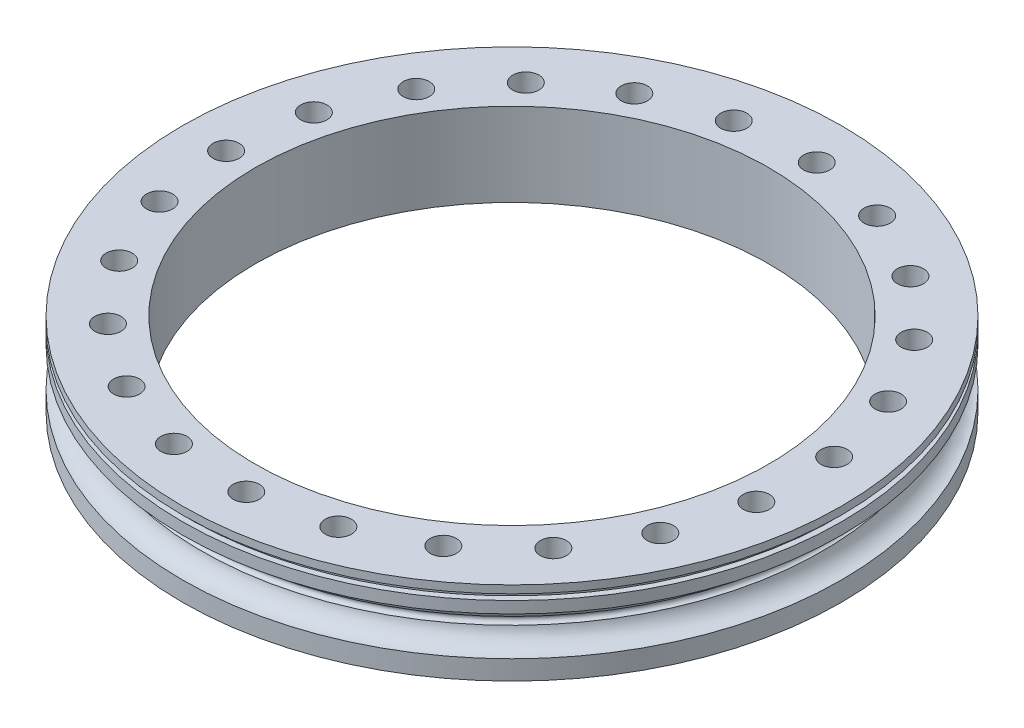
ISO-10303-21;
HEADER;
FILE_DESCRIPTION(('STEP AP214'),'2;1');
FILE_NAME('part.step','',(''),(''),'','','');
FILE_SCHEMA(('AUTOMOTIVE_DESIGN { 1 0 10303 214 1 1 1 1 }'));
ENDSEC;
DATA;
#1=APPLICATION_CONTEXT('core data for automotive mechanical design processes');
#2=APPLICATION_PROTOCOL_DEFINITION('international standard','automotive_design',2000,#1);
#3=PRODUCT_CONTEXT('',#1,'mechanical');
#4=PRODUCT('Part','Part','',(#3));
#5=PRODUCT_RELATED_PRODUCT_CATEGORY('part','',(#4));
#6=PRODUCT_DEFINITION_FORMATION('','',#4);
#7=PRODUCT_DEFINITION_CONTEXT('part definition',#1,'design');
#8=PRODUCT_DEFINITION('design','',#6,#7);
#9=PRODUCT_DEFINITION_SHAPE('','',#8);
#10=(LENGTH_UNIT() NAMED_UNIT(*) SI_UNIT(.MILLI.,.METRE.));
#11=(NAMED_UNIT(*) PLANE_ANGLE_UNIT() SI_UNIT($,.RADIAN.));
#12=(NAMED_UNIT(*) SI_UNIT($,.STERADIAN.) SOLID_ANGLE_UNIT());
#13=UNCERTAINTY_MEASURE_WITH_UNIT(LENGTH_MEASURE(1.E-05),#10,'distance_accuracy_value','');
#14=(GEOMETRIC_REPRESENTATION_CONTEXT(3) GLOBAL_UNCERTAINTY_ASSIGNED_CONTEXT((#13)) GLOBAL_UNIT_ASSIGNED_CONTEXT((#10,
#11,#12)) REPRESENTATION_CONTEXT('',''));
#15=CARTESIAN_POINT('',(0.,0.,0.));
#16=DIRECTION('',(0.,0.,1.));
#17=DIRECTION('',(1.,0.,0.));
#18=AXIS2_PLACEMENT_3D('',#15,#16,#17);
#19=CARTESIAN_POINT('',(0.,43.,0.));
#20=DIRECTION('',(0.,1.,0.));
#21=DIRECTION('',(-1.,0.,0.));
#22=AXIS2_PLACEMENT_3D('',#19,#20,#21);
#23=CYLINDRICAL_SURFACE('',#22,170.);
#24=CARTESIAN_POINT('',(0.,30.,0.));
#25=DIRECTION('',(0.,1.,0.));
#26=DIRECTION('',(-1.,0.,0.));
#27=AXIS2_PLACEMENT_3D('',#24,#25,#26);
#28=CIRCLE('',#27,170.);
#29=CARTESIAN_POINT('',(-170.,30.,0.));
#30=VERTEX_POINT('',#29);
#31=EDGE_CURVE('E71',#30,#30,#28,.T.);
#32=ORIENTED_EDGE('',*,*,#31,.T.);
#33=EDGE_LOOP('',(#32));
#34=FACE_BOUND('',#33,.T.);
#35=CARTESIAN_POINT('',(0.,36.,0.));
#36=DIRECTION('',(0.,1.,0.));
#37=DIRECTION('',(-1.,0.,0.));
#38=AXIS2_PLACEMENT_3D('',#35,#36,#37);
#39=CIRCLE('',#38,170.);
#40=CARTESIAN_POINT('',(-170.,36.,0.));
#41=VERTEX_POINT('',#40);
#42=EDGE_CURVE('E10',#41,#41,#39,.T.);
#43=ORIENTED_EDGE('',*,*,#42,.F.);
#44=EDGE_LOOP('',(#43));
#45=FACE_BOUND('',#44,.T.);
#46=ADVANCED_FACE('F31',(#34,#45),#23,.T.);
#47=CARTESIAN_POINT('',(-167.,36.,0.));
#48=DIRECTION('',(0.,1.,0.));
#49=DIRECTION('',(-1.,0.,0.));
#50=AXIS2_PLACEMENT_3D('',#47,#48,#49);
#51=PLANE('',#50);
#52=ORIENTED_EDGE('',*,*,#42,.T.);
#53=EDGE_LOOP('',(#52));
#54=FACE_BOUND('',#53,.T.);
#55=CARTESIAN_POINT('',(0.,36.,0.));
#56=DIRECTION('',(0.,1.,0.));
#57=DIRECTION('',(-1.,0.,0.));
#58=AXIS2_PLACEMENT_3D('',#55,#56,#57);
#59=CIRCLE('',#58,167.);
#60=CARTESIAN_POINT('',(-167.,36.,0.));
#61=VERTEX_POINT('',#60);
#62=EDGE_CURVE('E37',#61,#61,#59,.T.);
#63=ORIENTED_EDGE('',*,*,#62,.F.);
#64=EDGE_LOOP('',(#63));
#65=FACE_BOUND('',#64,.T.);
#66=ADVANCED_FACE('F314',(#54,#65),#51,.T.);
#67=CARTESIAN_POINT('',(0.,43.,0.));
#68=DIRECTION('',(0.,1.,0.));
#69=DIRECTION('',(-1.,0.,0.));
#70=AXIS2_PLACEMENT_3D('',#67,#68,#69);
#71=CYLINDRICAL_SURFACE('',#70,167.);
#72=ORIENTED_EDGE('',*,*,#62,.T.);
#73=EDGE_LOOP('',(#72));
#74=FACE_BOUND('',#73,.T.);
#75=CARTESIAN_POINT('',(0.,39.,0.));
#76=DIRECTION('',(0.,1.,0.));
#77=DIRECTION('',(-1.,0.,0.));
#78=AXIS2_PLACEMENT_3D('',#75,#76,#77);
#79=CIRCLE('',#78,167.);
#80=CARTESIAN_POINT('',(-167.,39.,0.));
#81=VERTEX_POINT('',#80);
#82=EDGE_CURVE('E41',#81,#81,#79,.T.);
#83=ORIENTED_EDGE('',*,*,#82,.F.);
#84=EDGE_LOOP('',(#83));
#85=FACE_BOUND('',#84,.T.);
#86=ADVANCED_FACE('F318',(#74,#85),#71,.T.);
#87=CARTESIAN_POINT('',(-170.,39.,0.));
#88=DIRECTION('',(0.,-1.,0.));
#89=DIRECTION('',(1.,0.,0.));
#90=AXIS2_PLACEMENT_3D('',#87,#88,#89);
#91=PLANE('',#90);
#92=ORIENTED_EDGE('',*,*,#82,.T.);
#93=EDGE_LOOP('',(#92));
#94=FACE_BOUND('',#93,.T.);
#95=CARTESIAN_POINT('',(0.,39.,0.));
#96=DIRECTION('',(0.,1.,0.));
#97=DIRECTION('',(-1.,0.,0.));
#98=AXIS2_PLACEMENT_3D('',#95,#96,#97);
#99=CIRCLE('',#98,170.);
#100=CARTESIAN_POINT('',(-170.,39.,0.));
#101=VERTEX_POINT('',#100);
#102=EDGE_CURVE('E45',#101,#101,#99,.T.);
#103=ORIENTED_EDGE('',*,*,#102,.F.);
#104=EDGE_LOOP('',(#103));
#105=FACE_BOUND('',#104,.T.);
#106=ADVANCED_FACE('F322',(#94,#105),#91,.T.);
#107=CARTESIAN_POINT('',(0.,43.,0.));
#108=DIRECTION('',(0.,1.,0.));
#109=DIRECTION('',(-1.,0.,0.));
#110=AXIS2_PLACEMENT_3D('',#107,#108,#109);
#111=CYLINDRICAL_SURFACE('',#110,170.);
#112=ORIENTED_EDGE('',*,*,#102,.T.);
#113=EDGE_LOOP('',(#112));
#114=FACE_BOUND('',#113,.T.);
#115=CARTESIAN_POINT('',(0.,43.,0.));
#116=DIRECTION('',(0.,1.,0.));
#117=DIRECTION('',(-1.,0.,0.));
#118=AXIS2_PLACEMENT_3D('',#115,#116,#117);
#119=CIRCLE('',#118,170.);
#120=CARTESIAN_POINT('',(-170.,43.,0.));
#121=VERTEX_POINT('',#120);
#122=EDGE_CURVE('E50',#121,#121,#119,.T.);
#123=ORIENTED_EDGE('',*,*,#122,.F.);
#124=EDGE_LOOP('',(#123));
#125=FACE_BOUND('',#124,.T.);
#126=ADVANCED_FACE('F227',(#114,#125),#111,.T.);
#127=CARTESIAN_POINT('',(-170.,43.,0.));
#128=DIRECTION('',(0.,1.,0.));
#129=DIRECTION('',(-1.,0.,0.));
#130=AXIS2_PLACEMENT_3D('',#127,#128,#129);
#131=PLANE('',#130);
#132=CARTESIAN_POINT('',(-142.030299883801,43.,39.7950237456592));
#133=DIRECTION('',(0.,1.,0.));
#134=DIRECTION('',(0.269796771157012,0.,0.962917287347803));
#135=AXIS2_PLACEMENT_3D('',#132,#133,#134);
#136=CIRCLE('',#135,6.75);
#137=CARTESIAN_POINT('',(-140.209171678491,43.,46.2947154352569));
#138=VERTEX_POINT('',#137);
#139=EDGE_CURVE('E206',#138,#138,#136,.T.);
#140=ORIENTED_EDGE('',*,*,#139,.F.);
#141=EDGE_LOOP('',(#140));
#142=FACE_BOUND('',#141,.T.);
#143=CARTESIAN_POINT('',(-126.026862170608,43.,76.6386326302249));
#144=DIRECTION('',(0.,1.,0.));
#145=DIRECTION('',(0.519583950035423,0.,0.854419404546495));
#146=AXIS2_PLACEMENT_3D('',#143,#144,#145);
#147=CIRCLE('',#146,6.75);
#148=CARTESIAN_POINT('',(-122.519670507869,43.,82.4059636109137));
#149=VERTEX_POINT('',#148);
#150=EDGE_CURVE('E200',#149,#149,#147,.T.);
#151=ORIENTED_EDGE('',*,*,#150,.F.);
#152=EDGE_LOOP('',(#151));
#153=FACE_BOUND('',#152,.T.);
#154=CARTESIAN_POINT('',(-100.676588624753,43.,107.798304731022));
#155=DIRECTION('',(0.,1.,0.));
#156=DIRECTION('',(0.730835964278116,0.,0.682553143218663));
#157=AXIS2_PLACEMENT_3D('',#154,#155,#156);
#158=CIRCLE('',#157,6.75);
#159=CARTESIAN_POINT('',(-95.7434458658754,43.,112.405538447748));
#160=VERTEX_POINT('',#159);
#161=EDGE_CURVE('E194',#160,#160,#158,.T.);
#162=ORIENTED_EDGE('',*,*,#161,.F.);
#163=EDGE_LOOP('',(#162));
#164=FACE_BOUND('',#163,.T.);
#165=CARTESIAN_POINT('',(-67.8595930653463,43.,130.96306971435));
#166=DIRECTION('',(0.,1.,0.));
#167=DIRECTION('',(0.88788521840237,0.,0.460065037731162));
#168=AXIS2_PLACEMENT_3D('',#165,#166,#167);
#169=CIRCLE('',#168,6.75);
#170=CARTESIAN_POINT('',(-61.8663678411303,43.,134.068508719035));
#171=VERTEX_POINT('',#170);
#172=EDGE_CURVE('E188',#171,#171,#169,.T.);
#173=ORIENTED_EDGE('',*,*,#172,.F.);
#174=EDGE_LOOP('',(#173));
#175=FACE_BOUND('',#174,.T.);
#176=CARTESIAN_POINT('',(-30.0097619252651,43.,144.414902933142));
#177=DIRECTION('',(0.,1.,0.));
#178=DIRECTION('',(0.979084087682321,0.,0.203456013052645));
#179=AXIS2_PLACEMENT_3D('',#176,#177,#178);
#180=CIRCLE('',#179,6.75);
#181=CARTESIAN_POINT('',(-23.4009443334094,43.,145.788231021248));
#182=VERTEX_POINT('',#181);
#183=EDGE_CURVE('E182',#182,#182,#180,.T.);
#184=ORIENTED_EDGE('',*,*,#183,.F.);
#185=EDGE_LOOP('',(#184));
#186=FACE_BOUND('',#185,.T.);
#187=CARTESIAN_POINT('',(10.0657559712875,43.,147.156143455605));
#188=DIRECTION('',(0.,1.,0.));
#189=DIRECTION('',(0.99766876919054,0.,-0.0682424133646607));
#190=AXIS2_PLACEMENT_3D('',#187,#188,#189);
#191=CIRCLE('',#190,6.75);
#192=CARTESIAN_POINT('',(16.8000201633236,43.,146.695507165393));
#193=VERTEX_POINT('',#192);
#194=EDGE_CURVE('E176',#193,#193,#191,.T.);
#195=ORIENTED_EDGE('',*,*,#194,.F.);
#196=EDGE_LOOP('',(#195));
#197=FACE_BOUND('',#196,.T.);
#198=CARTESIAN_POINT('',(49.3947427952191,43.,138.983486012526));
#199=DIRECTION('',(0.,1.,0.));
#200=DIRECTION('',(0.942260922118824,0.,-0.334879612170977));
#201=AXIS2_PLACEMENT_3D('',#198,#199,#200);
#202=CIRCLE('',#201,6.75);
#203=CARTESIAN_POINT('',(55.7550040195212,43.,136.723048630372));
#204=VERTEX_POINT('',#203);
#205=EDGE_CURVE('E170',#204,#204,#202,.T.);
#206=ORIENTED_EDGE('',*,*,#205,.F.);
#207=EDGE_LOOP('',(#206));
#208=FACE_BOUND('',#207,.T.);
#209=CARTESIAN_POINT('',(85.0603475119419,43.,120.503059219041));
#210=DIRECTION('',(0.,1.,0.));
#211=DIRECTION('',(0.816969893010447,0.,-0.57668032211486));
#212=AXIS2_PLACEMENT_3D('',#209,#210,#211);
#213=CIRCLE('',#212,6.75);
#214=CARTESIAN_POINT('',(90.5748942897624,43.,116.610467044766));
#215=VERTEX_POINT('',#214);
#216=EDGE_CURVE('E164',#215,#215,#213,.T.);
#217=ORIENTED_EDGE('',*,*,#216,.F.);
#218=EDGE_LOOP('',(#217));
#219=FACE_BOUND('',#218,.T.);
#220=CARTESIAN_POINT('',(114.417415378901,43.,93.0854717880937));
#221=DIRECTION('',(0.,1.,0.));
#222=DIRECTION('',(0.631087944326059,0.,-0.775711290704414));
#223=AXIS2_PLACEMENT_3D('',#220,#221,#222);
#224=CIRCLE('',#223,6.75);
#225=CARTESIAN_POINT('',(118.677259003102,43.,87.8494205758389));
#226=VERTEX_POINT('',#225);
#227=EDGE_CURVE('E158',#226,#226,#224,.T.);
#228=ORIENTED_EDGE('',*,*,#227,.F.);
#229=EDGE_LOOP('',(#228));
#230=FACE_BOUND('',#229,.T.);
#231=CARTESIAN_POINT('',(135.288666972054,43.,58.7641607523217));
#232=DIRECTION('',(0.,1.,0.));
#233=DIRECTION('',(0.398401089846249,0.,-0.91721130150545));
#234=AXIS2_PLACEMENT_3D('',#231,#232,#233);
#235=CIRCLE('',#234,6.75);
#236=CARTESIAN_POINT('',(137.977874328516,43.,52.5729844671599));
#237=VERTEX_POINT('',#236);
#238=EDGE_CURVE('E152',#237,#237,#235,.T.);
#239=ORIENTED_EDGE('',*,*,#238,.F.);
#240=EDGE_LOOP('',(#239));
#241=FACE_BOUND('',#240,.T.);
#242=CARTESIAN_POINT('',(146.126177040359,43.,20.0845807416974));
#243=DIRECTION('',(0.,1.,0.));
#244=DIRECTION('',(0.136166649096254,0.,-0.99068594603633));
#245=AXIS2_PLACEMENT_3D('',#242,#243,#244);
#246=CIRCLE('',#245,6.75);
#247=CARTESIAN_POINT('',(147.045301921758,43.,13.3974506059522));
#248=VERTEX_POINT('',#247);
#249=EDGE_CURVE('E146',#248,#248,#246,.T.);
#250=ORIENTED_EDGE('',*,*,#249,.F.);
#251=EDGE_LOOP('',(#250));
#252=FACE_BOUND('',#251,.T.);
#253=CARTESIAN_POINT('',(146.126177040359,43.,-20.0845807416954));
#254=DIRECTION('',(0.,1.,0.));
#255=DIRECTION('',(-0.13616664909624,0.,-0.990685946036332));
#256=AXIS2_PLACEMENT_3D('',#253,#254,#255);
#257=CIRCLE('',#256,6.75);
#258=CARTESIAN_POINT('',(145.207052158959,43.,-26.7717108774407));
#259=VERTEX_POINT('',#258);
#260=EDGE_CURVE('E140',#259,#259,#257,.T.);
#261=ORIENTED_EDGE('',*,*,#260,.F.);
#262=EDGE_LOOP('',(#261));
#263=FACE_BOUND('',#262,.T.);
#264=CARTESIAN_POINT('',(135.288666972055,43.,-58.7641607523198));
#265=DIRECTION('',(0.,1.,0.));
#266=DIRECTION('',(-0.398401089846236,0.,-0.917211301505455));
#267=AXIS2_PLACEMENT_3D('',#264,#265,#266);
#268=CIRCLE('',#267,6.75);
#269=CARTESIAN_POINT('',(132.599459615593,43.,-64.9553370374817));
#270=VERTEX_POINT('',#269);
#271=EDGE_CURVE('E134',#270,#270,#268,.T.);
#272=ORIENTED_EDGE('',*,*,#271,.F.);
#273=EDGE_LOOP('',(#272));
#274=FACE_BOUND('',#273,.T.);
#275=CARTESIAN_POINT('',(114.417415378902,43.,-93.0854717880922));
#276=DIRECTION('',(0.,1.,0.));
#277=DIRECTION('',(-0.631087944326049,0.,-0.775711290704423));
#278=AXIS2_PLACEMENT_3D('',#275,#276,#277);
#279=CIRCLE('',#278,6.75);
#280=CARTESIAN_POINT('',(110.157571754702,43.,-98.321523000347));
#281=VERTEX_POINT('',#280);
#282=EDGE_CURVE('E128',#281,#281,#279,.T.);
#283=ORIENTED_EDGE('',*,*,#282,.F.);
#284=EDGE_LOOP('',(#283));
#285=FACE_BOUND('',#284,.T.);
#286=CARTESIAN_POINT('',(85.0603475119435,43.,-120.50305921904));
#287=DIRECTION('',(0.,1.,0.));
#288=DIRECTION('',(-0.816969893010439,0.,-0.576680322114871));
#289=AXIS2_PLACEMENT_3D('',#286,#287,#288);
#290=CIRCLE('',#289,6.75);
#291=CARTESIAN_POINT('',(79.545800734123,43.,-124.395651393315));
#292=VERTEX_POINT('',#291);
#293=EDGE_CURVE('E122',#292,#292,#290,.T.);
#294=ORIENTED_EDGE('',*,*,#293,.F.);
#295=EDGE_LOOP('',(#294));
#296=FACE_BOUND('',#295,.T.);
#297=CARTESIAN_POINT('',(49.394742795221,43.,-138.983486012526));
#298=DIRECTION('',(0.,1.,0.));
#299=DIRECTION('',(-0.942260922118819,0.,-0.33487961217099));
#300=AXIS2_PLACEMENT_3D('',#297,#298,#299);
#301=CIRCLE('',#300,6.75);
#302=CARTESIAN_POINT('',(43.034481570919,43.,-141.24392339468));
#303=VERTEX_POINT('',#302);
#304=EDGE_CURVE('E116',#303,#303,#301,.T.);
#305=ORIENTED_EDGE('',*,*,#304,.F.);
#306=EDGE_LOOP('',(#305));
#307=FACE_BOUND('',#306,.T.);
#308=CARTESIAN_POINT('',(10.0657559712895,43.,-147.156143455604));
#309=DIRECTION('',(0.,1.,0.));
#310=DIRECTION('',(-0.997668769190539,0.,-0.0682424133646747));
#311=AXIS2_PLACEMENT_3D('',#308,#309,#310);
#312=CIRCLE('',#311,6.75);
#313=CARTESIAN_POINT('',(3.33149177925336,43.,-147.616779745816));
#314=VERTEX_POINT('',#313);
#315=EDGE_CURVE('E110',#314,#314,#312,.T.);
#316=ORIENTED_EDGE('',*,*,#315,.F.);
#317=EDGE_LOOP('',(#316));
#318=FACE_BOUND('',#317,.T.);
#319=CARTESIAN_POINT('',(-30.0097619252631,43.,-144.414902933143));
#320=DIRECTION('',(0.,1.,0.));
#321=DIRECTION('',(-0.979084087682323,0.,0.203456013052631));
#322=AXIS2_PLACEMENT_3D('',#319,#320,#321);
#323=CIRCLE('',#322,6.75);
#324=CARTESIAN_POINT('',(-36.6185795171188,43.,-143.041574845037));
#325=VERTEX_POINT('',#324);
#326=EDGE_CURVE('E104',#325,#325,#323,.T.);
#327=ORIENTED_EDGE('',*,*,#326,.F.);
#328=EDGE_LOOP('',(#327));
#329=FACE_BOUND('',#328,.T.);
#330=CARTESIAN_POINT('',(-67.8595930653446,43.,-130.963069714351));
#331=DIRECTION('',(0.,1.,0.));
#332=DIRECTION('',(-0.887885218402376,0.,0.46006503773115));
#333=AXIS2_PLACEMENT_3D('',#330,#331,#332);
#334=CIRCLE('',#333,6.75);
#335=CARTESIAN_POINT('',(-73.8528182895607,43.,-127.857630709665));
#336=VERTEX_POINT('',#335);
#337=EDGE_CURVE('E98',#336,#336,#334,.T.);
#338=ORIENTED_EDGE('',*,*,#337,.F.);
#339=EDGE_LOOP('',(#338));
#340=FACE_BOUND('',#339,.T.);
#341=CARTESIAN_POINT('',(-100.676588624751,43.,-107.798304731023));
#342=DIRECTION('',(0.,1.,0.));
#343=DIRECTION('',(-0.730835964278125,0.,0.682553143218653));
#344=AXIS2_PLACEMENT_3D('',#341,#342,#343);
#345=CIRCLE('',#344,6.75);
#346=CARTESIAN_POINT('',(-105.609731383629,43.,-103.191071014298));
#347=VERTEX_POINT('',#346);
#348=EDGE_CURVE('E92',#347,#347,#345,.T.);
#349=ORIENTED_EDGE('',*,*,#348,.F.);
#350=EDGE_LOOP('',(#349));
#351=FACE_BOUND('',#350,.T.);
#352=CARTESIAN_POINT('',(-126.026862170607,43.,-76.6386326302266));
#353=DIRECTION('',(0.,1.,0.));
#354=DIRECTION('',(-0.519583950035435,0.,0.854419404546488));
#355=AXIS2_PLACEMENT_3D('',#352,#353,#354);
#356=CIRCLE('',#355,6.75);
#357=CARTESIAN_POINT('',(-129.534053833346,43.,-70.8713016495378));
#358=VERTEX_POINT('',#357);
#359=EDGE_CURVE('E86',#358,#358,#356,.T.);
#360=ORIENTED_EDGE('',*,*,#359,.F.);
#361=EDGE_LOOP('',(#360));
#362=FACE_BOUND('',#361,.T.);
#363=CARTESIAN_POINT('',(-142.0302998838,43.,-39.7950237456611));
#364=DIRECTION('',(0.,1.,0.));
#365=DIRECTION('',(-0.269796771157025,0.,0.962917287347799));
#366=AXIS2_PLACEMENT_3D('',#363,#364,#365);
#367=CIRCLE('',#366,6.75);
#368=CARTESIAN_POINT('',(-143.85142808911,43.,-33.2953320560635));
#369=VERTEX_POINT('',#368);
#370=EDGE_CURVE('E78',#369,#369,#367,.T.);
#371=ORIENTED_EDGE('',*,*,#370,.F.);
#372=EDGE_LOOP('',(#371));
#373=FACE_BOUND('',#372,.T.);
#374=CARTESIAN_POINT('',(-147.5,43.,0.));
#375=DIRECTION('',(0.,1.,0.));
#376=DIRECTION('',(0.,0.,1.));
#377=AXIS2_PLACEMENT_3D('',#374,#375,#376);
#378=CIRCLE('',#377,6.75);
#379=CARTESIAN_POINT('',(-147.5,43.,6.75000000000002));
#380=VERTEX_POINT('',#379);
#381=EDGE_CURVE('E75',#380,#380,#378,.T.);
#382=ORIENTED_EDGE('',*,*,#381,.F.);
#383=EDGE_LOOP('',(#382));
#384=FACE_BOUND('',#383,.T.);
#385=ORIENTED_EDGE('',*,*,#122,.T.);
#386=EDGE_LOOP('',(#385));
#387=FACE_BOUND('',#386,.T.);
#388=CARTESIAN_POINT('',(0.,43.,0.));
#389=DIRECTION('',(0.,1.,0.));
#390=DIRECTION('',(-1.,0.,0.));
#391=AXIS2_PLACEMENT_3D('',#388,#389,#390);
#392=CIRCLE('',#391,132.5);
#393=CARTESIAN_POINT('',(-132.5,43.,0.));
#394=VERTEX_POINT('',#393);
#395=EDGE_CURVE('E53',#394,#394,#392,.T.);
#396=ORIENTED_EDGE('',*,*,#395,.F.);
#397=EDGE_LOOP('',(#396));
#398=FACE_BOUND('',#397,.T.);
#399=ADVANCED_FACE('F223',(#142,#153,#164,#175,#186,#197,#208,#219,#230,#241,#252,#263,#274,
#285,#296,#307,#318,#329,#340,#351,#362,#373,#384,#387,#398),#131,.T.);
#400=CARTESIAN_POINT('',(0.,43.,0.));
#401=DIRECTION('',(0.,1.,0.));
#402=DIRECTION('',(-1.,0.,0.));
#403=AXIS2_PLACEMENT_3D('',#400,#401,#402);
#404=CYLINDRICAL_SURFACE('',#403,132.5);
#405=ORIENTED_EDGE('',*,*,#395,.T.);
#406=EDGE_LOOP('',(#405));
#407=FACE_BOUND('',#406,.T.);
#408=CARTESIAN_POINT('',(0.,0.,0.));
#409=DIRECTION('',(0.,1.,0.));
#410=DIRECTION('',(-1.,0.,0.));
#411=AXIS2_PLACEMENT_3D('',#408,#409,#410);
#412=CIRCLE('',#411,132.5);
#413=CARTESIAN_POINT('',(-132.5,0.,0.));
#414=VERTEX_POINT('',#413);
#415=EDGE_CURVE('E56',#414,#414,#412,.T.);
#416=ORIENTED_EDGE('',*,*,#415,.F.);
#417=EDGE_LOOP('',(#416));
#418=FACE_BOUND('',#417,.T.);
#419=ADVANCED_FACE('F226',(#407,#418),#404,.F.);
#420=CARTESIAN_POINT('',(-132.5,0.,0.));
#421=DIRECTION('',(0.,-1.,0.));
#422=DIRECTION('',(1.,0.,0.));
#423=AXIS2_PLACEMENT_3D('',#420,#421,#422);
#424=PLANE('',#423);
#425=CARTESIAN_POINT('',(-142.030299883801,0.,39.7950237456592));
#426=DIRECTION('',(0.,1.,0.));
#427=DIRECTION('',(0.269796771157012,0.,0.962917287347803));
#428=AXIS2_PLACEMENT_3D('',#425,#426,#427);
#429=CIRCLE('',#428,6.75);
#430=CARTESIAN_POINT('',(-140.209171678491,0.,46.2947154352569));
#431=VERTEX_POINT('',#430);
#432=EDGE_CURVE('E209',#431,#431,#429,.T.);
#433=ORIENTED_EDGE('',*,*,#432,.T.);
#434=EDGE_LOOP('',(#433));
#435=FACE_BOUND('',#434,.T.);
#436=CARTESIAN_POINT('',(-126.026862170608,0.,76.6386326302249));
#437=DIRECTION('',(0.,1.,0.));
#438=DIRECTION('',(0.519583950035423,0.,0.854419404546495));
#439=AXIS2_PLACEMENT_3D('',#436,#437,#438);
#440=CIRCLE('',#439,6.75);
#441=CARTESIAN_POINT('',(-122.519670507869,0.,82.4059636109137));
#442=VERTEX_POINT('',#441);
#443=EDGE_CURVE('E203',#442,#442,#440,.T.);
#444=ORIENTED_EDGE('',*,*,#443,.T.);
#445=EDGE_LOOP('',(#444));
#446=FACE_BOUND('',#445,.T.);
#447=CARTESIAN_POINT('',(-100.676588624753,0.,107.798304731022));
#448=DIRECTION('',(0.,1.,0.));
#449=DIRECTION('',(0.730835964278116,0.,0.682553143218663));
#450=AXIS2_PLACEMENT_3D('',#447,#448,#449);
#451=CIRCLE('',#450,6.75);
#452=CARTESIAN_POINT('',(-95.7434458658754,0.,112.405538447748));
#453=VERTEX_POINT('',#452);
#454=EDGE_CURVE('E197',#453,#453,#451,.T.);
#455=ORIENTED_EDGE('',*,*,#454,.T.);
#456=EDGE_LOOP('',(#455));
#457=FACE_BOUND('',#456,.T.);
#458=CARTESIAN_POINT('',(-67.8595930653463,0.,130.96306971435));
#459=DIRECTION('',(0.,1.,0.));
#460=DIRECTION('',(0.88788521840237,0.,0.460065037731162));
#461=AXIS2_PLACEMENT_3D('',#458,#459,#460);
#462=CIRCLE('',#461,6.75);
#463=CARTESIAN_POINT('',(-61.8663678411303,0.,134.068508719035));
#464=VERTEX_POINT('',#463);
#465=EDGE_CURVE('E191',#464,#464,#462,.T.);
#466=ORIENTED_EDGE('',*,*,#465,.T.);
#467=EDGE_LOOP('',(#466));
#468=FACE_BOUND('',#467,.T.);
#469=CARTESIAN_POINT('',(-30.0097619252651,0.,144.414902933142));
#470=DIRECTION('',(0.,1.,0.));
#471=DIRECTION('',(0.979084087682321,0.,0.203456013052645));
#472=AXIS2_PLACEMENT_3D('',#469,#470,#471);
#473=CIRCLE('',#472,6.75);
#474=CARTESIAN_POINT('',(-23.4009443334094,0.,145.788231021248));
#475=VERTEX_POINT('',#474);
#476=EDGE_CURVE('E185',#475,#475,#473,.T.);
#477=ORIENTED_EDGE('',*,*,#476,.T.);
#478=EDGE_LOOP('',(#477));
#479=FACE_BOUND('',#478,.T.);
#480=CARTESIAN_POINT('',(10.0657559712875,0.,147.156143455605));
#481=DIRECTION('',(0.,1.,0.));
#482=DIRECTION('',(0.99766876919054,0.,-0.0682424133646607));
#483=AXIS2_PLACEMENT_3D('',#480,#481,#482);
#484=CIRCLE('',#483,6.75);
#485=CARTESIAN_POINT('',(16.8000201633236,0.,146.695507165393));
#486=VERTEX_POINT('',#485);
#487=EDGE_CURVE('E179',#486,#486,#484,.T.);
#488=ORIENTED_EDGE('',*,*,#487,.T.);
#489=EDGE_LOOP('',(#488));
#490=FACE_BOUND('',#489,.T.);
#491=CARTESIAN_POINT('',(49.3947427952191,0.,138.983486012526));
#492=DIRECTION('',(0.,1.,0.));
#493=DIRECTION('',(0.942260922118824,0.,-0.334879612170977));
#494=AXIS2_PLACEMENT_3D('',#491,#492,#493);
#495=CIRCLE('',#494,6.75);
#496=CARTESIAN_POINT('',(55.7550040195212,0.,136.723048630372));
#497=VERTEX_POINT('',#496);
#498=EDGE_CURVE('E173',#497,#497,#495,.T.);
#499=ORIENTED_EDGE('',*,*,#498,.T.);
#500=EDGE_LOOP('',(#499));
#501=FACE_BOUND('',#500,.T.);
#502=CARTESIAN_POINT('',(85.0603475119419,0.,120.503059219041));
#503=DIRECTION('',(0.,1.,0.));
#504=DIRECTION('',(0.816969893010447,0.,-0.57668032211486));
#505=AXIS2_PLACEMENT_3D('',#502,#503,#504);
#506=CIRCLE('',#505,6.75);
#507=CARTESIAN_POINT('',(90.5748942897624,0.,116.610467044766));
#508=VERTEX_POINT('',#507);
#509=EDGE_CURVE('E167',#508,#508,#506,.T.);
#510=ORIENTED_EDGE('',*,*,#509,.T.);
#511=EDGE_LOOP('',(#510));
#512=FACE_BOUND('',#511,.T.);
#513=CARTESIAN_POINT('',(114.417415378901,0.,93.0854717880937));
#514=DIRECTION('',(0.,1.,0.));
#515=DIRECTION('',(0.631087944326059,0.,-0.775711290704414));
#516=AXIS2_PLACEMENT_3D('',#513,#514,#515);
#517=CIRCLE('',#516,6.75);
#518=CARTESIAN_POINT('',(118.677259003102,0.,87.8494205758389));
#519=VERTEX_POINT('',#518);
#520=EDGE_CURVE('E161',#519,#519,#517,.T.);
#521=ORIENTED_EDGE('',*,*,#520,.T.);
#522=EDGE_LOOP('',(#521));
#523=FACE_BOUND('',#522,.T.);
#524=CARTESIAN_POINT('',(135.288666972054,0.,58.7641607523217));
#525=DIRECTION('',(0.,1.,0.));
#526=DIRECTION('',(0.398401089846249,0.,-0.91721130150545));
#527=AXIS2_PLACEMENT_3D('',#524,#525,#526);
#528=CIRCLE('',#527,6.75);
#529=CARTESIAN_POINT('',(137.977874328516,0.,52.5729844671599));
#530=VERTEX_POINT('',#529);
#531=EDGE_CURVE('E155',#530,#530,#528,.T.);
#532=ORIENTED_EDGE('',*,*,#531,.T.);
#533=EDGE_LOOP('',(#532));
#534=FACE_BOUND('',#533,.T.);
#535=CARTESIAN_POINT('',(146.126177040359,0.,20.0845807416974));
#536=DIRECTION('',(0.,1.,0.));
#537=DIRECTION('',(0.136166649096254,0.,-0.99068594603633));
#538=AXIS2_PLACEMENT_3D('',#535,#536,#537);
#539=CIRCLE('',#538,6.75);
#540=CARTESIAN_POINT('',(147.045301921758,0.,13.3974506059522));
#541=VERTEX_POINT('',#540);
#542=EDGE_CURVE('E149',#541,#541,#539,.T.);
#543=ORIENTED_EDGE('',*,*,#542,.T.);
#544=EDGE_LOOP('',(#543));
#545=FACE_BOUND('',#544,.T.);
#546=CARTESIAN_POINT('',(146.126177040359,0.,-20.0845807416954));
#547=DIRECTION('',(0.,1.,0.));
#548=DIRECTION('',(-0.13616664909624,0.,-0.990685946036332));
#549=AXIS2_PLACEMENT_3D('',#546,#547,#548);
#550=CIRCLE('',#549,6.75);
#551=CARTESIAN_POINT('',(145.207052158959,0.,-26.7717108774407));
#552=VERTEX_POINT('',#551);
#553=EDGE_CURVE('E143',#552,#552,#550,.T.);
#554=ORIENTED_EDGE('',*,*,#553,.T.);
#555=EDGE_LOOP('',(#554));
#556=FACE_BOUND('',#555,.T.);
#557=CARTESIAN_POINT('',(135.288666972055,0.,-58.7641607523198));
#558=DIRECTION('',(0.,1.,0.));
#559=DIRECTION('',(-0.398401089846236,0.,-0.917211301505455));
#560=AXIS2_PLACEMENT_3D('',#557,#558,#559);
#561=CIRCLE('',#560,6.75);
#562=CARTESIAN_POINT('',(132.599459615593,0.,-64.9553370374817));
#563=VERTEX_POINT('',#562);
#564=EDGE_CURVE('E137',#563,#563,#561,.T.);
#565=ORIENTED_EDGE('',*,*,#564,.T.);
#566=EDGE_LOOP('',(#565));
#567=FACE_BOUND('',#566,.T.);
#568=CARTESIAN_POINT('',(114.417415378902,0.,-93.0854717880922));
#569=DIRECTION('',(0.,1.,0.));
#570=DIRECTION('',(-0.631087944326049,0.,-0.775711290704423));
#571=AXIS2_PLACEMENT_3D('',#568,#569,#570);
#572=CIRCLE('',#571,6.75);
#573=CARTESIAN_POINT('',(110.157571754702,0.,-98.321523000347));
#574=VERTEX_POINT('',#573);
#575=EDGE_CURVE('E131',#574,#574,#572,.T.);
#576=ORIENTED_EDGE('',*,*,#575,.T.);
#577=EDGE_LOOP('',(#576));
#578=FACE_BOUND('',#577,.T.);
#579=CARTESIAN_POINT('',(85.0603475119435,0.,-120.50305921904));
#580=DIRECTION('',(0.,1.,0.));
#581=DIRECTION('',(-0.816969893010439,0.,-0.576680322114871));
#582=AXIS2_PLACEMENT_3D('',#579,#580,#581);
#583=CIRCLE('',#582,6.75);
#584=CARTESIAN_POINT('',(79.545800734123,0.,-124.395651393315));
#585=VERTEX_POINT('',#584);
#586=EDGE_CURVE('E125',#585,#585,#583,.T.);
#587=ORIENTED_EDGE('',*,*,#586,.T.);
#588=EDGE_LOOP('',(#587));
#589=FACE_BOUND('',#588,.T.);
#590=CARTESIAN_POINT('',(49.394742795221,0.,-138.983486012526));
#591=DIRECTION('',(0.,1.,0.));
#592=DIRECTION('',(-0.942260922118819,0.,-0.33487961217099));
#593=AXIS2_PLACEMENT_3D('',#590,#591,#592);
#594=CIRCLE('',#593,6.75);
#595=CARTESIAN_POINT('',(43.034481570919,0.,-141.24392339468));
#596=VERTEX_POINT('',#595);
#597=EDGE_CURVE('E119',#596,#596,#594,.T.);
#598=ORIENTED_EDGE('',*,*,#597,.T.);
#599=EDGE_LOOP('',(#598));
#600=FACE_BOUND('',#599,.T.);
#601=CARTESIAN_POINT('',(10.0657559712895,0.,-147.156143455604));
#602=DIRECTION('',(0.,1.,0.));
#603=DIRECTION('',(-0.997668769190539,0.,-0.0682424133646747));
#604=AXIS2_PLACEMENT_3D('',#601,#602,#603);
#605=CIRCLE('',#604,6.75);
#606=CARTESIAN_POINT('',(3.33149177925336,0.,-147.616779745816));
#607=VERTEX_POINT('',#606);
#608=EDGE_CURVE('E113',#607,#607,#605,.T.);
#609=ORIENTED_EDGE('',*,*,#608,.T.);
#610=EDGE_LOOP('',(#609));
#611=FACE_BOUND('',#610,.T.);
#612=CARTESIAN_POINT('',(-30.0097619252631,0.,-144.414902933143));
#613=DIRECTION('',(0.,1.,0.));
#614=DIRECTION('',(-0.979084087682323,0.,0.203456013052631));
#615=AXIS2_PLACEMENT_3D('',#612,#613,#614);
#616=CIRCLE('',#615,6.75);
#617=CARTESIAN_POINT('',(-36.6185795171188,0.,-143.041574845037));
#618=VERTEX_POINT('',#617);
#619=EDGE_CURVE('E107',#618,#618,#616,.T.);
#620=ORIENTED_EDGE('',*,*,#619,.T.);
#621=EDGE_LOOP('',(#620));
#622=FACE_BOUND('',#621,.T.);
#623=CARTESIAN_POINT('',(-67.8595930653446,0.,-130.963069714351));
#624=DIRECTION('',(0.,1.,0.));
#625=DIRECTION('',(-0.887885218402376,0.,0.46006503773115));
#626=AXIS2_PLACEMENT_3D('',#623,#624,#625);
#627=CIRCLE('',#626,6.75);
#628=CARTESIAN_POINT('',(-73.8528182895607,0.,-127.857630709665));
#629=VERTEX_POINT('',#628);
#630=EDGE_CURVE('E101',#629,#629,#627,.T.);
#631=ORIENTED_EDGE('',*,*,#630,.T.);
#632=EDGE_LOOP('',(#631));
#633=FACE_BOUND('',#632,.T.);
#634=CARTESIAN_POINT('',(-100.676588624751,0.,-107.798304731023));
#635=DIRECTION('',(0.,1.,0.));
#636=DIRECTION('',(-0.730835964278125,0.,0.682553143218653));
#637=AXIS2_PLACEMENT_3D('',#634,#635,#636);
#638=CIRCLE('',#637,6.75);
#639=CARTESIAN_POINT('',(-105.609731383629,0.,-103.191071014298));
#640=VERTEX_POINT('',#639);
#641=EDGE_CURVE('E95',#640,#640,#638,.T.);
#642=ORIENTED_EDGE('',*,*,#641,.T.);
#643=EDGE_LOOP('',(#642));
#644=FACE_BOUND('',#643,.T.);
#645=CARTESIAN_POINT('',(-126.026862170607,0.,-76.6386326302266));
#646=DIRECTION('',(0.,1.,0.));
#647=DIRECTION('',(-0.519583950035435,0.,0.854419404546488));
#648=AXIS2_PLACEMENT_3D('',#645,#646,#647);
#649=CIRCLE('',#648,6.75);
#650=CARTESIAN_POINT('',(-129.534053833346,0.,-70.8713016495378));
#651=VERTEX_POINT('',#650);
#652=EDGE_CURVE('E89',#651,#651,#649,.T.);
#653=ORIENTED_EDGE('',*,*,#652,.T.);
#654=EDGE_LOOP('',(#653));
#655=FACE_BOUND('',#654,.T.);
#656=CARTESIAN_POINT('',(-142.0302998838,0.,-39.7950237456611));
#657=DIRECTION('',(0.,1.,0.));
#658=DIRECTION('',(-0.269796771157025,0.,0.962917287347799));
#659=AXIS2_PLACEMENT_3D('',#656,#657,#658);
#660=CIRCLE('',#659,6.75);
#661=CARTESIAN_POINT('',(-143.85142808911,0.,-33.2953320560635));
#662=VERTEX_POINT('',#661);
#663=EDGE_CURVE('E83',#662,#662,#660,.T.);
#664=ORIENTED_EDGE('',*,*,#663,.T.);
#665=EDGE_LOOP('',(#664));
#666=FACE_BOUND('',#665,.T.);
#667=CARTESIAN_POINT('',(-147.5,0.,0.));
#668=DIRECTION('',(0.,1.,0.));
#669=DIRECTION('',(0.,0.,1.));
#670=AXIS2_PLACEMENT_3D('',#667,#668,#669);
#671=CIRCLE('',#670,6.75);
#672=CARTESIAN_POINT('',(-147.5,0.,6.75000000000002));
#673=VERTEX_POINT('',#672);
#674=EDGE_CURVE('E74',#673,#673,#671,.T.);
#675=ORIENTED_EDGE('',*,*,#674,.T.);
#676=EDGE_LOOP('',(#675));
#677=FACE_BOUND('',#676,.T.);
#678=ORIENTED_EDGE('',*,*,#415,.T.);
#679=EDGE_LOOP('',(#678));
#680=FACE_BOUND('',#679,.T.);
#681=CARTESIAN_POINT('',(0.,0.,0.));
#682=DIRECTION('',(0.,1.,0.));
#683=DIRECTION('',(-1.,0.,0.));
#684=AXIS2_PLACEMENT_3D('',#681,#682,#683);
#685=CIRCLE('',#684,170.);
#686=CARTESIAN_POINT('',(-170.,0.,0.));
#687=VERTEX_POINT('',#686);
#688=EDGE_CURVE('E59',#687,#687,#685,.T.);
#689=ORIENTED_EDGE('',*,*,#688,.F.);
#690=EDGE_LOOP('',(#689));
#691=FACE_BOUND('',#690,.T.);
#692=ADVANCED_FACE('F213',(#435,#446,#457,#468,#479,#490,#501,#512,#523,#534,#545,#556,#567,
#578,#589,#600,#611,#622,#633,#644,#655,#666,#677,#680,#691),#424,.T.);
#693=CARTESIAN_POINT('',(0.,43.,0.));
#694=DIRECTION('',(0.,1.,0.));
#695=DIRECTION('',(-1.,0.,0.));
#696=AXIS2_PLACEMENT_3D('',#693,#694,#695);
#697=CYLINDRICAL_SURFACE('',#696,170.);
#698=ORIENTED_EDGE('',*,*,#688,.T.);
#699=EDGE_LOOP('',(#698));
#700=FACE_BOUND('',#699,.T.);
#701=CARTESIAN_POINT('',(0.,9.99999999999999,0.));
#702=DIRECTION('',(0.,1.,0.));
#703=DIRECTION('',(-1.,0.,0.));
#704=AXIS2_PLACEMENT_3D('',#701,#702,#703);
#705=CIRCLE('',#704,170.);
#706=CARTESIAN_POINT('',(-170.,9.99999999999999,0.));
#707=VERTEX_POINT('',#706);
#708=EDGE_CURVE('E62',#707,#707,#705,.T.);
#709=ORIENTED_EDGE('',*,*,#708,.F.);
#710=EDGE_LOOP('',(#709));
#711=FACE_BOUND('',#710,.T.);
#712=ADVANCED_FACE('F284',(#700,#711),#697,.T.);
#713=CARTESIAN_POINT('',(0.,20.,0.));
#714=DIRECTION('',(0.,1.,0.));
#715=DIRECTION('',(-1.,0.,0.));
#716=AXIS2_PLACEMENT_3D('',#713,#714,#715);
#717=TOROIDAL_SURFACE('',#716,170.,10.);
#718=ORIENTED_EDGE('',*,*,#708,.T.);
#719=EDGE_LOOP('',(#718));
#720=FACE_BOUND('',#719,.T.);
#721=CARTESIAN_POINT('',(0.,18.0230290524583,0.));
#722=DIRECTION('',(0.,1.,0.));
#723=DIRECTION('',(-1.,0.,0.));
#724=AXIS2_PLACEMENT_3D('',#721,#722,#723);
#725=CIRCLE('',#724,160.197368421053);
#726=CARTESIAN_POINT('',(-160.197368421053,18.0230290524583,0.));
#727=VERTEX_POINT('',#726);
#728=EDGE_CURVE('E65',#727,#727,#725,.T.);
#729=ORIENTED_EDGE('',*,*,#728,.F.);
#730=EDGE_LOOP('',(#729));
#731=FACE_BOUND('',#730,.T.);
#732=ADVANCED_FACE('F290',(#720,#731),#717,.F.);
#733=CARTESIAN_POINT('',(0.,20.,0.));
#734=DIRECTION('',(0.,1.,0.));
#735=DIRECTION('',(-1.,0.,0.));
#736=AXIS2_PLACEMENT_3D('',#733,#734,#735);
#737=TOROIDAL_SURFACE('',#736,160.5,2.);
#738=ORIENTED_EDGE('',*,*,#728,.T.);
#739=EDGE_LOOP('',(#738));
#740=FACE_BOUND('',#739,.T.);
#741=CARTESIAN_POINT('',(0.,21.9769709475417,0.));
#742=DIRECTION('',(0.,1.,0.));
#743=DIRECTION('',(-1.,0.,0.));
#744=AXIS2_PLACEMENT_3D('',#741,#742,#743);
#745=CIRCLE('',#744,160.197368421053);
#746=CARTESIAN_POINT('',(-160.197368421053,21.9769709475417,0.));
#747=VERTEX_POINT('',#746);
#748=EDGE_CURVE('E68',#747,#747,#745,.T.);
#749=ORIENTED_EDGE('',*,*,#748,.F.);
#750=EDGE_LOOP('',(#749));
#751=FACE_BOUND('',#750,.T.);
#752=ADVANCED_FACE('F296',(#740,#751),#737,.F.);
#753=CARTESIAN_POINT('',(0.,20.,0.));
#754=DIRECTION('',(0.,1.,0.));
#755=DIRECTION('',(-1.,0.,0.));
#756=AXIS2_PLACEMENT_3D('',#753,#754,#755);
#757=TOROIDAL_SURFACE('',#756,170.,10.);
#758=ORIENTED_EDGE('',*,*,#748,.T.);
#759=EDGE_LOOP('',(#758));
#760=FACE_BOUND('',#759,.T.);
#761=ORIENTED_EDGE('',*,*,#31,.F.);
#762=EDGE_LOOP('',(#761));
#763=FACE_BOUND('',#762,.T.);
#764=ADVANCED_FACE('F302',(#760,#763),#757,.F.);
#765=CARTESIAN_POINT('',(-147.5,0.,0.));
#766=DIRECTION('',(0.,1.,0.));
#767=DIRECTION('',(0.,0.,1.));
#768=AXIS2_PLACEMENT_3D('',#765,#766,#767);
#769=CYLINDRICAL_SURFACE('',#768,6.75);
#770=ORIENTED_EDGE('',*,*,#674,.F.);
#771=EDGE_LOOP('',(#770));
#772=FACE_BOUND('',#771,.T.);
#773=ORIENTED_EDGE('',*,*,#381,.T.);
#774=EDGE_LOOP('',(#773));
#775=FACE_BOUND('',#774,.T.);
#776=ADVANCED_FACE('F308',(#772,#775),#769,.F.);
#777=CARTESIAN_POINT('',(-142.0302998838,0.,-39.7950237456611));
#778=DIRECTION('',(0.,1.,0.));
#779=DIRECTION('',(-0.269796771157025,0.,0.962917287347799));
#780=AXIS2_PLACEMENT_3D('',#777,#778,#779);
#781=CYLINDRICAL_SURFACE('',#780,6.75);
#782=ORIENTED_EDGE('',*,*,#663,.F.);
#783=EDGE_LOOP('',(#782));
#784=FACE_BOUND('',#783,.T.);
#785=ORIENTED_EDGE('',*,*,#370,.T.);
#786=EDGE_LOOP('',(#785));
#787=FACE_BOUND('',#786,.T.);
#788=ADVANCED_FACE('F334',(#784,#787),#781,.F.);
#789=CARTESIAN_POINT('',(-126.026862170607,0.,-76.6386326302266));
#790=DIRECTION('',(0.,1.,0.));
#791=DIRECTION('',(-0.519583950035435,0.,0.854419404546488));
#792=AXIS2_PLACEMENT_3D('',#789,#790,#791);
#793=CYLINDRICAL_SURFACE('',#792,6.75);
#794=ORIENTED_EDGE('',*,*,#652,.F.);
#795=EDGE_LOOP('',(#794));
#796=FACE_BOUND('',#795,.T.);
#797=ORIENTED_EDGE('',*,*,#359,.T.);
#798=EDGE_LOOP('',(#797));
#799=FACE_BOUND('',#798,.T.);
#800=ADVANCED_FACE('F338',(#796,#799),#793,.F.);
#801=CARTESIAN_POINT('',(-100.676588624751,0.,-107.798304731023));
#802=DIRECTION('',(0.,1.,0.));
#803=DIRECTION('',(-0.730835964278125,0.,0.682553143218653));
#804=AXIS2_PLACEMENT_3D('',#801,#802,#803);
#805=CYLINDRICAL_SURFACE('',#804,6.75);
#806=ORIENTED_EDGE('',*,*,#641,.F.);
#807=EDGE_LOOP('',(#806));
#808=FACE_BOUND('',#807,.T.);
#809=ORIENTED_EDGE('',*,*,#348,.T.);
#810=EDGE_LOOP('',(#809));
#811=FACE_BOUND('',#810,.T.);
#812=ADVANCED_FACE('F342',(#808,#811),#805,.F.);
#813=CARTESIAN_POINT('',(-67.8595930653446,0.,-130.963069714351));
#814=DIRECTION('',(0.,1.,0.));
#815=DIRECTION('',(-0.887885218402376,0.,0.46006503773115));
#816=AXIS2_PLACEMENT_3D('',#813,#814,#815);
#817=CYLINDRICAL_SURFACE('',#816,6.75);
#818=ORIENTED_EDGE('',*,*,#630,.F.);
#819=EDGE_LOOP('',(#818));
#820=FACE_BOUND('',#819,.T.);
#821=ORIENTED_EDGE('',*,*,#337,.T.);
#822=EDGE_LOOP('',(#821));
#823=FACE_BOUND('',#822,.T.);
#824=ADVANCED_FACE('F346',(#820,#823),#817,.F.);
#825=CARTESIAN_POINT('',(-30.0097619252631,0.,-144.414902933143));
#826=DIRECTION('',(0.,1.,0.));
#827=DIRECTION('',(-0.979084087682323,0.,0.203456013052631));
#828=AXIS2_PLACEMENT_3D('',#825,#826,#827);
#829=CYLINDRICAL_SURFACE('',#828,6.75);
#830=ORIENTED_EDGE('',*,*,#619,.F.);
#831=EDGE_LOOP('',(#830));
#832=FACE_BOUND('',#831,.T.);
#833=ORIENTED_EDGE('',*,*,#326,.T.);
#834=EDGE_LOOP('',(#833));
#835=FACE_BOUND('',#834,.T.);
#836=ADVANCED_FACE('F350',(#832,#835),#829,.F.);
#837=CARTESIAN_POINT('',(10.0657559712895,0.,-147.156143455604));
#838=DIRECTION('',(0.,1.,0.));
#839=DIRECTION('',(-0.997668769190539,0.,-0.0682424133646747));
#840=AXIS2_PLACEMENT_3D('',#837,#838,#839);
#841=CYLINDRICAL_SURFACE('',#840,6.75);
#842=ORIENTED_EDGE('',*,*,#608,.F.);
#843=EDGE_LOOP('',(#842));
#844=FACE_BOUND('',#843,.T.);
#845=ORIENTED_EDGE('',*,*,#315,.T.);
#846=EDGE_LOOP('',(#845));
#847=FACE_BOUND('',#846,.T.);
#848=ADVANCED_FACE('F354',(#844,#847),#841,.F.);
#849=CARTESIAN_POINT('',(49.394742795221,0.,-138.983486012526));
#850=DIRECTION('',(0.,1.,0.));
#851=DIRECTION('',(-0.942260922118819,0.,-0.33487961217099));
#852=AXIS2_PLACEMENT_3D('',#849,#850,#851);
#853=CYLINDRICAL_SURFACE('',#852,6.75);
#854=ORIENTED_EDGE('',*,*,#597,.F.);
#855=EDGE_LOOP('',(#854));
#856=FACE_BOUND('',#855,.T.);
#857=ORIENTED_EDGE('',*,*,#304,.T.);
#858=EDGE_LOOP('',(#857));
#859=FACE_BOUND('',#858,.T.);
#860=ADVANCED_FACE('F358',(#856,#859),#853,.F.);
#861=CARTESIAN_POINT('',(85.0603475119435,0.,-120.50305921904));
#862=DIRECTION('',(0.,1.,0.));
#863=DIRECTION('',(-0.816969893010439,0.,-0.576680322114871));
#864=AXIS2_PLACEMENT_3D('',#861,#862,#863);
#865=CYLINDRICAL_SURFACE('',#864,6.75);
#866=ORIENTED_EDGE('',*,*,#586,.F.);
#867=EDGE_LOOP('',(#866));
#868=FACE_BOUND('',#867,.T.);
#869=ORIENTED_EDGE('',*,*,#293,.T.);
#870=EDGE_LOOP('',(#869));
#871=FACE_BOUND('',#870,.T.);
#872=ADVANCED_FACE('F362',(#868,#871),#865,.F.);
#873=CARTESIAN_POINT('',(114.417415378902,0.,-93.0854717880922));
#874=DIRECTION('',(0.,1.,0.));
#875=DIRECTION('',(-0.631087944326049,0.,-0.775711290704423));
#876=AXIS2_PLACEMENT_3D('',#873,#874,#875);
#877=CYLINDRICAL_SURFACE('',#876,6.75);
#878=ORIENTED_EDGE('',*,*,#575,.F.);
#879=EDGE_LOOP('',(#878));
#880=FACE_BOUND('',#879,.T.);
#881=ORIENTED_EDGE('',*,*,#282,.T.);
#882=EDGE_LOOP('',(#881));
#883=FACE_BOUND('',#882,.T.);
#884=ADVANCED_FACE('F366',(#880,#883),#877,.F.);
#885=CARTESIAN_POINT('',(135.288666972055,0.,-58.7641607523198));
#886=DIRECTION('',(0.,1.,0.));
#887=DIRECTION('',(-0.398401089846236,0.,-0.917211301505455));
#888=AXIS2_PLACEMENT_3D('',#885,#886,#887);
#889=CYLINDRICAL_SURFACE('',#888,6.75);
#890=ORIENTED_EDGE('',*,*,#564,.F.);
#891=EDGE_LOOP('',(#890));
#892=FACE_BOUND('',#891,.T.);
#893=ORIENTED_EDGE('',*,*,#271,.T.);
#894=EDGE_LOOP('',(#893));
#895=FACE_BOUND('',#894,.T.);
#896=ADVANCED_FACE('F370',(#892,#895),#889,.F.);
#897=CARTESIAN_POINT('',(146.126177040359,0.,-20.0845807416954));
#898=DIRECTION('',(0.,1.,0.));
#899=DIRECTION('',(-0.13616664909624,0.,-0.990685946036332));
#900=AXIS2_PLACEMENT_3D('',#897,#898,#899);
#901=CYLINDRICAL_SURFACE('',#900,6.75);
#902=ORIENTED_EDGE('',*,*,#553,.F.);
#903=EDGE_LOOP('',(#902));
#904=FACE_BOUND('',#903,.T.);
#905=ORIENTED_EDGE('',*,*,#260,.T.);
#906=EDGE_LOOP('',(#905));
#907=FACE_BOUND('',#906,.T.);
#908=ADVANCED_FACE('F374',(#904,#907),#901,.F.);
#909=CARTESIAN_POINT('',(146.126177040359,0.,20.0845807416974));
#910=DIRECTION('',(0.,1.,0.));
#911=DIRECTION('',(0.136166649096254,0.,-0.99068594603633));
#912=AXIS2_PLACEMENT_3D('',#909,#910,#911);
#913=CYLINDRICAL_SURFACE('',#912,6.75);
#914=ORIENTED_EDGE('',*,*,#542,.F.);
#915=EDGE_LOOP('',(#914));
#916=FACE_BOUND('',#915,.T.);
#917=ORIENTED_EDGE('',*,*,#249,.T.);
#918=EDGE_LOOP('',(#917));
#919=FACE_BOUND('',#918,.T.);
#920=ADVANCED_FACE('F378',(#916,#919),#913,.F.);
#921=CARTESIAN_POINT('',(135.288666972054,0.,58.7641607523217));
#922=DIRECTION('',(0.,1.,0.));
#923=DIRECTION('',(0.398401089846249,0.,-0.91721130150545));
#924=AXIS2_PLACEMENT_3D('',#921,#922,#923);
#925=CYLINDRICAL_SURFACE('',#924,6.75);
#926=ORIENTED_EDGE('',*,*,#531,.F.);
#927=EDGE_LOOP('',(#926));
#928=FACE_BOUND('',#927,.T.);
#929=ORIENTED_EDGE('',*,*,#238,.T.);
#930=EDGE_LOOP('',(#929));
#931=FACE_BOUND('',#930,.T.);
#932=ADVANCED_FACE('F382',(#928,#931),#925,.F.);
#933=CARTESIAN_POINT('',(114.417415378901,0.,93.0854717880937));
#934=DIRECTION('',(0.,1.,0.));
#935=DIRECTION('',(0.631087944326059,0.,-0.775711290704414));
#936=AXIS2_PLACEMENT_3D('',#933,#934,#935);
#937=CYLINDRICAL_SURFACE('',#936,6.75);
#938=ORIENTED_EDGE('',*,*,#520,.F.);
#939=EDGE_LOOP('',(#938));
#940=FACE_BOUND('',#939,.T.);
#941=ORIENTED_EDGE('',*,*,#227,.T.);
#942=EDGE_LOOP('',(#941));
#943=FACE_BOUND('',#942,.T.);
#944=ADVANCED_FACE('F386',(#940,#943),#937,.F.);
#945=CARTESIAN_POINT('',(85.0603475119419,0.,120.503059219041));
#946=DIRECTION('',(0.,1.,0.));
#947=DIRECTION('',(0.816969893010447,0.,-0.57668032211486));
#948=AXIS2_PLACEMENT_3D('',#945,#946,#947);
#949=CYLINDRICAL_SURFACE('',#948,6.75);
#950=ORIENTED_EDGE('',*,*,#509,.F.);
#951=EDGE_LOOP('',(#950));
#952=FACE_BOUND('',#951,.T.);
#953=ORIENTED_EDGE('',*,*,#216,.T.);
#954=EDGE_LOOP('',(#953));
#955=FACE_BOUND('',#954,.T.);
#956=ADVANCED_FACE('F390',(#952,#955),#949,.F.);
#957=CARTESIAN_POINT('',(49.3947427952191,0.,138.983486012526));
#958=DIRECTION('',(0.,1.,0.));
#959=DIRECTION('',(0.942260922118824,0.,-0.334879612170977));
#960=AXIS2_PLACEMENT_3D('',#957,#958,#959);
#961=CYLINDRICAL_SURFACE('',#960,6.75);
#962=ORIENTED_EDGE('',*,*,#498,.F.);
#963=EDGE_LOOP('',(#962));
#964=FACE_BOUND('',#963,.T.);
#965=ORIENTED_EDGE('',*,*,#205,.T.);
#966=EDGE_LOOP('',(#965));
#967=FACE_BOUND('',#966,.T.);
#968=ADVANCED_FACE('F394',(#964,#967),#961,.F.);
#969=CARTESIAN_POINT('',(10.0657559712875,0.,147.156143455605));
#970=DIRECTION('',(0.,1.,0.));
#971=DIRECTION('',(0.99766876919054,0.,-0.0682424133646607));
#972=AXIS2_PLACEMENT_3D('',#969,#970,#971);
#973=CYLINDRICAL_SURFACE('',#972,6.75);
#974=ORIENTED_EDGE('',*,*,#487,.F.);
#975=EDGE_LOOP('',(#974));
#976=FACE_BOUND('',#975,.T.);
#977=ORIENTED_EDGE('',*,*,#194,.T.);
#978=EDGE_LOOP('',(#977));
#979=FACE_BOUND('',#978,.T.);
#980=ADVANCED_FACE('F398',(#976,#979),#973,.F.);
#981=CARTESIAN_POINT('',(-30.0097619252651,0.,144.414902933142));
#982=DIRECTION('',(0.,1.,0.));
#983=DIRECTION('',(0.979084087682321,0.,0.203456013052645));
#984=AXIS2_PLACEMENT_3D('',#981,#982,#983);
#985=CYLINDRICAL_SURFACE('',#984,6.75);
#986=ORIENTED_EDGE('',*,*,#476,.F.);
#987=EDGE_LOOP('',(#986));
#988=FACE_BOUND('',#987,.T.);
#989=ORIENTED_EDGE('',*,*,#183,.T.);
#990=EDGE_LOOP('',(#989));
#991=FACE_BOUND('',#990,.T.);
#992=ADVANCED_FACE('F402',(#988,#991),#985,.F.);
#993=CARTESIAN_POINT('',(-67.8595930653463,0.,130.96306971435));
#994=DIRECTION('',(0.,1.,0.));
#995=DIRECTION('',(0.88788521840237,0.,0.460065037731162));
#996=AXIS2_PLACEMENT_3D('',#993,#994,#995);
#997=CYLINDRICAL_SURFACE('',#996,6.75);
#998=ORIENTED_EDGE('',*,*,#465,.F.);
#999=EDGE_LOOP('',(#998));
#1000=FACE_BOUND('',#999,.T.);
#1001=ORIENTED_EDGE('',*,*,#172,.T.);
#1002=EDGE_LOOP('',(#1001));
#1003=FACE_BOUND('',#1002,.T.);
#1004=ADVANCED_FACE('F406',(#1000,#1003),#997,.F.);
#1005=CARTESIAN_POINT('',(-100.676588624753,0.,107.798304731022));
#1006=DIRECTION('',(0.,1.,0.));
#1007=DIRECTION('',(0.730835964278116,0.,0.682553143218663));
#1008=AXIS2_PLACEMENT_3D('',#1005,#1006,#1007);
#1009=CYLINDRICAL_SURFACE('',#1008,6.75);
#1010=ORIENTED_EDGE('',*,*,#454,.F.);
#1011=EDGE_LOOP('',(#1010));
#1012=FACE_BOUND('',#1011,.T.);
#1013=ORIENTED_EDGE('',*,*,#161,.T.);
#1014=EDGE_LOOP('',(#1013));
#1015=FACE_BOUND('',#1014,.T.);
#1016=ADVANCED_FACE('F410',(#1012,#1015),#1009,.F.);
#1017=CARTESIAN_POINT('',(-126.026862170608,0.,76.6386326302249));
#1018=DIRECTION('',(0.,1.,0.));
#1019=DIRECTION('',(0.519583950035423,0.,0.854419404546495));
#1020=AXIS2_PLACEMENT_3D('',#1017,#1018,#1019);
#1021=CYLINDRICAL_SURFACE('',#1020,6.75);
#1022=ORIENTED_EDGE('',*,*,#443,.F.);
#1023=EDGE_LOOP('',(#1022));
#1024=FACE_BOUND('',#1023,.T.);
#1025=ORIENTED_EDGE('',*,*,#150,.T.);
#1026=EDGE_LOOP('',(#1025));
#1027=FACE_BOUND('',#1026,.T.);
#1028=ADVANCED_FACE('F219',(#1024,#1027),#1021,.F.);
#1029=CARTESIAN_POINT('',(-142.030299883801,0.,39.7950237456592));
#1030=DIRECTION('',(0.,1.,0.));
#1031=DIRECTION('',(0.269796771157012,0.,0.962917287347803));
#1032=AXIS2_PLACEMENT_3D('',#1029,#1030,#1031);
#1033=CYLINDRICAL_SURFACE('',#1032,6.75);
#1034=ORIENTED_EDGE('',*,*,#432,.F.);
#1035=EDGE_LOOP('',(#1034));
#1036=FACE_BOUND('',#1035,.T.);
#1037=ORIENTED_EDGE('',*,*,#139,.T.);
#1038=EDGE_LOOP('',(#1037));
#1039=FACE_BOUND('',#1038,.T.);
#1040=ADVANCED_FACE('F216',(#1036,#1039),#1033,.F.);
#1041=CLOSED_SHELL('',(#46,#66,#86,#106,#126,#399,#419,#692,#712,#732,#752,#764,#776,#788,#800,
#812,#824,#836,#848,#860,#872,#884,#896,#908,#920,#932,#944,#956,#968,#980,#992,#1004,#1016,
#1028,#1040));
#1042=MANIFOLD_SOLID_BREP('B2',#1041);
#1043=ADVANCED_BREP_SHAPE_REPRESENTATION('',(#18,#1042),#14);
#1044=SHAPE_DEFINITION_REPRESENTATION(#9,#1043);
ENDSEC;
END-ISO-10303-21;
